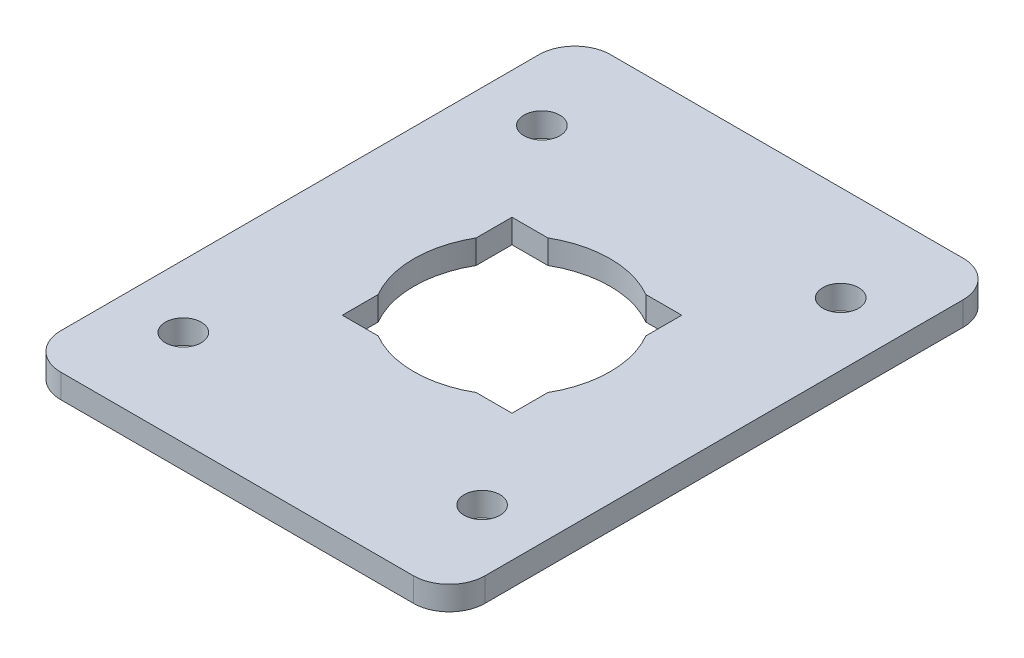
ISO-10303-21;
HEADER;
FILE_DESCRIPTION(('STEP AP214'),'2;1');
FILE_NAME('part.step','',(''),(''),'','','');
FILE_SCHEMA(('AUTOMOTIVE_DESIGN { 1 0 10303 214 1 1 1 1 }'));
ENDSEC;
DATA;
#1=APPLICATION_CONTEXT('core data for automotive mechanical design processes');
#2=APPLICATION_PROTOCOL_DEFINITION('international standard','automotive_design',2000,#1);
#3=PRODUCT_CONTEXT('',#1,'mechanical');
#4=PRODUCT('Part','Part','',(#3));
#5=PRODUCT_RELATED_PRODUCT_CATEGORY('part','',(#4));
#6=PRODUCT_DEFINITION_FORMATION('','',#4);
#7=PRODUCT_DEFINITION_CONTEXT('part definition',#1,'design');
#8=PRODUCT_DEFINITION('design','',#6,#7);
#9=PRODUCT_DEFINITION_SHAPE('','',#8);
#10=(LENGTH_UNIT() NAMED_UNIT(*) SI_UNIT(.MILLI.,.METRE.));
#11=(NAMED_UNIT(*) PLANE_ANGLE_UNIT() SI_UNIT($,.RADIAN.));
#12=(NAMED_UNIT(*) SI_UNIT($,.STERADIAN.) SOLID_ANGLE_UNIT());
#13=UNCERTAINTY_MEASURE_WITH_UNIT(LENGTH_MEASURE(1.E-05),#10,'distance_accuracy_value','');
#14=(GEOMETRIC_REPRESENTATION_CONTEXT(3) GLOBAL_UNCERTAINTY_ASSIGNED_CONTEXT((#13)) GLOBAL_UNIT_ASSIGNED_CONTEXT((#10,
#11,#12)) REPRESENTATION_CONTEXT('',''));
#15=CARTESIAN_POINT('',(0.,0.,0.));
#16=DIRECTION('',(0.,0.,1.));
#17=DIRECTION('',(1.,0.,0.));
#18=AXIS2_PLACEMENT_3D('',#15,#16,#17);
#19=CARTESIAN_POINT('',(0.,2.,0.));
#20=DIRECTION('',(0.,-1.,0.));
#21=DIRECTION('',(0.,0.,-1.));
#22=AXIS2_PLACEMENT_3D('',#19,#20,#21);
#23=PLANE('',#22);
#24=CARTESIAN_POINT('',(-11.6377120476314,2.,-22.25));
#25=DIRECTION('',(0.,-1.,0.));
#26=DIRECTION('',(0.,0.,-1.));
#27=AXIS2_PLACEMENT_3D('',#24,#25,#26);
#28=CIRCLE('',#27,1.5);
#29=CARTESIAN_POINT('',(-11.6377120476314,2.,-23.75));
#30=VERTEX_POINT('',#29);
#31=EDGE_CURVE('E224',#30,#30,#28,.T.);
#32=ORIENTED_EDGE('',*,*,#31,.T.);
#33=EDGE_LOOP('',(#32));
#34=FACE_BOUND('',#33,.T.);
#35=CARTESIAN_POINT('',(13.3622879523686,2.,7.75000000000001));
#36=DIRECTION('',(0.,-1.,0.));
#37=DIRECTION('',(0.,0.,-1.));
#38=AXIS2_PLACEMENT_3D('',#35,#36,#37);
#39=CIRCLE('',#38,1.5);
#40=CARTESIAN_POINT('',(13.3622879523686,2.,6.25000000000001));
#41=VERTEX_POINT('',#40);
#42=EDGE_CURVE('E627',#41,#41,#39,.T.);
#43=ORIENTED_EDGE('',*,*,#42,.T.);
#44=EDGE_LOOP('',(#43));
#45=FACE_BOUND('',#44,.T.);
#46=CARTESIAN_POINT('',(13.3622879523686,2.,-22.25));
#47=DIRECTION('',(0.,-1.,0.));
#48=DIRECTION('',(0.,0.,-1.));
#49=AXIS2_PLACEMENT_3D('',#46,#47,#48);
#50=CIRCLE('',#49,1.5);
#51=CARTESIAN_POINT('',(13.3622879523686,2.,-23.75));
#52=VERTEX_POINT('',#51);
#53=EDGE_CURVE('E629',#52,#52,#50,.T.);
#54=ORIENTED_EDGE('',*,*,#53,.T.);
#55=EDGE_LOOP('',(#54));
#56=FACE_BOUND('',#55,.T.);
#57=CARTESIAN_POINT('',(-11.6377120476314,2.,7.75000000000001));
#58=DIRECTION('',(0.,-1.,0.));
#59=DIRECTION('',(0.,0.,-1.));
#60=AXIS2_PLACEMENT_3D('',#57,#58,#59);
#61=CIRCLE('',#60,1.5);
#62=CARTESIAN_POINT('',(-11.6377120476314,2.,6.25));
#63=VERTEX_POINT('',#62);
#64=EDGE_CURVE('E634',#63,#63,#61,.T.);
#65=ORIENTED_EDGE('',*,*,#64,.T.);
#66=EDGE_LOOP('',(#65));
#67=FACE_BOUND('',#66,.T.);
#68=DIRECTION('',(1.,0.,0.));
#69=VECTOR('',#68,1.);
#70=CARTESIAN_POINT('',(-16.8877120476314,2.,15.75));
#71=LINE('',#70,#69);
#72=CARTESIAN_POINT('',(-13.8877120476314,2.,15.75));
#73=VERTEX_POINT('',#72);
#74=CARTESIAN_POINT('',(15.6122879523686,2.,15.75));
#75=VERTEX_POINT('',#74);
#76=EDGE_CURVE('E278',#73,#75,#71,.T.);
#77=ORIENTED_EDGE('',*,*,#76,.T.);
#78=CARTESIAN_POINT('',(15.6122879523686,2.,12.75));
#79=DIRECTION('',(0.,-1.,0.));
#80=DIRECTION('',(0.,0.,-1.));
#81=AXIS2_PLACEMENT_3D('',#78,#79,#80);
#82=CIRCLE('',#81,3.);
#83=CARTESIAN_POINT('',(18.6122879523686,2.,12.75));
#84=VERTEX_POINT('',#83);
#85=EDGE_CURVE('E318',#75,#84,#82,.F.);
#86=ORIENTED_EDGE('',*,*,#85,.T.);
#87=DIRECTION('',(0.,0.,-1.));
#88=VECTOR('',#87,1.);
#89=CARTESIAN_POINT('',(18.6122879523686,2.,15.75));
#90=LINE('',#89,#88);
#91=CARTESIAN_POINT('',(18.6122879523686,2.,-27.25));
#92=VERTEX_POINT('',#91);
#93=EDGE_CURVE('E282',#84,#92,#90,.T.);
#94=ORIENTED_EDGE('',*,*,#93,.T.);
#95=CARTESIAN_POINT('',(15.6122879523686,2.,-27.25));
#96=DIRECTION('',(0.,-1.,0.));
#97=DIRECTION('',(0.,0.,-1.));
#98=AXIS2_PLACEMENT_3D('',#95,#96,#97);
#99=CIRCLE('',#98,3.);
#100=CARTESIAN_POINT('',(15.6122879523686,2.,-30.25));
#101=VERTEX_POINT('',#100);
#102=EDGE_CURVE('E57',#92,#101,#99,.F.);
#103=ORIENTED_EDGE('',*,*,#102,.T.);
#104=DIRECTION('',(-1.,0.,0.));
#105=VECTOR('',#104,1.);
#106=CARTESIAN_POINT('',(-16.8877120476314,2.,-30.25));
#107=LINE('',#106,#105);
#108=CARTESIAN_POINT('',(-13.8877120476314,2.,-30.25));
#109=VERTEX_POINT('',#108);
#110=EDGE_CURVE('E284',#101,#109,#107,.T.);
#111=ORIENTED_EDGE('',*,*,#110,.T.);
#112=CARTESIAN_POINT('',(-13.8877120476314,2.,-27.25));
#113=DIRECTION('',(0.,-1.,0.));
#114=DIRECTION('',(0.,0.,-1.));
#115=AXIS2_PLACEMENT_3D('',#112,#113,#114);
#116=CIRCLE('',#115,3.);
#117=CARTESIAN_POINT('',(-16.8877120476314,2.,-27.25));
#118=VERTEX_POINT('',#117);
#119=EDGE_CURVE('E314',#109,#118,#116,.F.);
#120=ORIENTED_EDGE('',*,*,#119,.T.);
#121=DIRECTION('',(0.,0.,1.));
#122=VECTOR('',#121,1.);
#123=CARTESIAN_POINT('',(-16.8877120476314,2.,15.75));
#124=LINE('',#123,#122);
#125=CARTESIAN_POINT('',(-16.8877120476314,2.,12.75));
#126=VERTEX_POINT('',#125);
#127=EDGE_CURVE('E275',#118,#126,#124,.T.);
#128=ORIENTED_EDGE('',*,*,#127,.T.);
#129=CARTESIAN_POINT('',(-13.8877120476314,2.,12.75));
#130=DIRECTION('',(0.,-1.,0.));
#131=DIRECTION('',(0.,0.,-1.));
#132=AXIS2_PLACEMENT_3D('',#129,#130,#131);
#133=CIRCLE('',#132,3.);
#134=EDGE_CURVE('E316',#126,#73,#133,.F.);
#135=ORIENTED_EDGE('',*,*,#134,.T.);
#136=EDGE_LOOP('',(#77,#86,#94,#103,#111,#120,#128,#135));
#137=FACE_BOUND('',#136,.T.);
#138=DIRECTION('',(1.,0.,0.));
#139=VECTOR('',#138,1.);
#140=CARTESIAN_POINT('',(4.96472625172183,2.,-0.149999999999997));
#141=LINE('',#140,#139);
#142=CARTESIAN_POINT('',(4.96472625172183,2.,-0.149999999999996));
#143=VERTEX_POINT('',#142);
#144=CARTESIAN_POINT('',(7.96228795236863,2.,-0.149999999999997));
#145=VERTEX_POINT('',#144);
#146=EDGE_CURVE('E175',#143,#145,#141,.T.);
#147=ORIENTED_EDGE('',*,*,#146,.F.);
#148=CARTESIAN_POINT('',(0.862287952368626,2.,-7.25));
#149=DIRECTION('',(0.,1.,0.));
#150=DIRECTION('',(0.,0.,1.));
#151=AXIS2_PLACEMENT_3D('',#148,#149,#150);
#152=CIRCLE('',#151,8.2);
#153=CARTESIAN_POINT('',(-3.24015034698457,2.,-0.149999999999996));
#154=VERTEX_POINT('',#153);
#155=EDGE_CURVE('E220',#154,#143,#152,.T.);
#156=ORIENTED_EDGE('',*,*,#155,.F.);
#157=DIRECTION('',(1.,0.,0.));
#158=VECTOR('',#157,1.);
#159=CARTESIAN_POINT('',(-6.23771204763137,2.,-0.149999999999995));
#160=LINE('',#159,#158);
#161=CARTESIAN_POINT('',(-6.23771204763137,2.,-0.149999999999995));
#162=VERTEX_POINT('',#161);
#163=EDGE_CURVE('E217',#162,#154,#160,.T.);
#164=ORIENTED_EDGE('',*,*,#163,.F.);
#165=DIRECTION('',(0.,0.,1.));
#166=VECTOR('',#165,1.);
#167=CARTESIAN_POINT('',(-6.23771204763137,2.,-3.1475617006468));
#168=LINE('',#167,#166);
#169=CARTESIAN_POINT('',(-6.23771204763137,2.,-3.1475617006468));
#170=VERTEX_POINT('',#169);
#171=EDGE_CURVE('E215',#170,#162,#168,.T.);
#172=ORIENTED_EDGE('',*,*,#171,.F.);
#173=CARTESIAN_POINT('',(0.862287952368626,2.,-7.25));
#174=DIRECTION('',(0.,1.,0.));
#175=DIRECTION('',(0.,0.,1.));
#176=AXIS2_PLACEMENT_3D('',#173,#174,#175);
#177=CIRCLE('',#176,8.2);
#178=CARTESIAN_POINT('',(-6.23771204763137,2.,-11.3524382993532));
#179=VERTEX_POINT('',#178);
#180=EDGE_CURVE('E213',#179,#170,#177,.T.);
#181=ORIENTED_EDGE('',*,*,#180,.F.);
#182=DIRECTION('',(0.,0.,1.));
#183=VECTOR('',#182,1.);
#184=CARTESIAN_POINT('',(-6.23771204763137,2.,-14.35));
#185=LINE('',#184,#183);
#186=CARTESIAN_POINT('',(-6.23771204763137,2.,-14.35));
#187=VERTEX_POINT('',#186);
#188=EDGE_CURVE('E211',#187,#179,#185,.T.);
#189=ORIENTED_EDGE('',*,*,#188,.F.);
#190=DIRECTION('',(-1.,0.,0.));
#191=VECTOR('',#190,1.);
#192=CARTESIAN_POINT('',(-6.23771204763137,2.,-14.35));
#193=LINE('',#192,#191);
#194=CARTESIAN_POINT('',(-3.24015034698458,2.,-14.35));
#195=VERTEX_POINT('',#194);
#196=EDGE_CURVE('E209',#195,#187,#193,.T.);
#197=ORIENTED_EDGE('',*,*,#196,.F.);
#198=CARTESIAN_POINT('',(0.862287952368626,2.,-7.25));
#199=DIRECTION('',(0.,1.,0.));
#200=DIRECTION('',(0.,0.,1.));
#201=AXIS2_PLACEMENT_3D('',#198,#199,#200);
#202=CIRCLE('',#201,8.2);
#203=CARTESIAN_POINT('',(4.96472625172184,2.,-14.35));
#204=VERTEX_POINT('',#203);
#205=EDGE_CURVE('E207',#204,#195,#202,.T.);
#206=ORIENTED_EDGE('',*,*,#205,.F.);
#207=DIRECTION('',(-1.,0.,0.));
#208=VECTOR('',#207,1.);
#209=CARTESIAN_POINT('',(4.96472625172184,2.,-14.35));
#210=LINE('',#209,#208);
#211=CARTESIAN_POINT('',(7.96228795236862,2.,-14.35));
#212=VERTEX_POINT('',#211);
#213=EDGE_CURVE('E205',#212,#204,#210,.T.);
#214=ORIENTED_EDGE('',*,*,#213,.F.);
#215=DIRECTION('',(0.,0.,-1.));
#216=VECTOR('',#215,1.);
#217=CARTESIAN_POINT('',(7.96228795236862,2.,-14.35));
#218=LINE('',#217,#216);
#219=CARTESIAN_POINT('',(7.96228795236862,2.,-11.3524382993532));
#220=VERTEX_POINT('',#219);
#221=EDGE_CURVE('E200',#220,#212,#218,.T.);
#222=ORIENTED_EDGE('',*,*,#221,.F.);
#223=CARTESIAN_POINT('',(0.862287952368626,2.,-7.25));
#224=DIRECTION('',(0.,1.,0.));
#225=DIRECTION('',(0.,0.,1.));
#226=AXIS2_PLACEMENT_3D('',#223,#224,#225);
#227=CIRCLE('',#226,8.2);
#228=CARTESIAN_POINT('',(7.96228795236863,2.,-3.1475617006468));
#229=VERTEX_POINT('',#228);
#230=EDGE_CURVE('E198',#229,#220,#227,.T.);
#231=ORIENTED_EDGE('',*,*,#230,.F.);
#232=DIRECTION('',(0.,0.,-1.));
#233=VECTOR('',#232,1.);
#234=CARTESIAN_POINT('',(7.96228795236863,2.,-3.1475617006468));
#235=LINE('',#234,#233);
#236=EDGE_CURVE('E185',#145,#229,#235,.T.);
#237=ORIENTED_EDGE('',*,*,#236,.F.);
#238=EDGE_LOOP('',(#147,#156,#164,#172,#181,#189,#197,#206,#214,#222,#231,#237));
#239=FACE_BOUND('',#238,.T.);
#240=ADVANCED_FACE('F37',(#34,#45,#56,#67,#137,#239),#23,.F.);
#241=CARTESIAN_POINT('',(0.,0.,0.));
#242=DIRECTION('',(0.,-1.,0.));
#243=DIRECTION('',(0.,0.,-1.));
#244=AXIS2_PLACEMENT_3D('',#241,#242,#243);
#245=PLANE('',#244);
#246=CARTESIAN_POINT('',(-11.6377120476314,0.,-22.25));
#247=DIRECTION('',(0.,-1.,0.));
#248=DIRECTION('',(0.,0.,1.));
#249=AXIS2_PLACEMENT_3D('',#246,#247,#248);
#250=CIRCLE('',#249,1.5);
#251=CARTESIAN_POINT('',(-11.6377120476314,0.,-20.75));
#252=VERTEX_POINT('',#251);
#253=EDGE_CURVE('E625',#252,#252,#250,.T.);
#254=ORIENTED_EDGE('',*,*,#253,.F.);
#255=EDGE_LOOP('',(#254));
#256=FACE_BOUND('',#255,.T.);
#257=CARTESIAN_POINT('',(13.3622879523686,0.,7.75000000000001));
#258=DIRECTION('',(0.,-1.,0.));
#259=DIRECTION('',(0.,0.,1.));
#260=AXIS2_PLACEMENT_3D('',#257,#258,#259);
#261=CIRCLE('',#260,1.5);
#262=CARTESIAN_POINT('',(13.3622879523686,0.,9.25000000000001));
#263=VERTEX_POINT('',#262);
#264=EDGE_CURVE('E642',#263,#263,#261,.T.);
#265=ORIENTED_EDGE('',*,*,#264,.F.);
#266=EDGE_LOOP('',(#265));
#267=FACE_BOUND('',#266,.T.);
#268=CARTESIAN_POINT('',(13.3622879523686,0.,-22.25));
#269=DIRECTION('',(0.,-1.,0.));
#270=DIRECTION('',(0.,0.,-1.));
#271=AXIS2_PLACEMENT_3D('',#268,#269,#270);
#272=CIRCLE('',#271,1.5);
#273=CARTESIAN_POINT('',(13.3622879523686,0.,-23.75));
#274=VERTEX_POINT('',#273);
#275=EDGE_CURVE('E640',#274,#274,#272,.T.);
#276=ORIENTED_EDGE('',*,*,#275,.F.);
#277=EDGE_LOOP('',(#276));
#278=FACE_BOUND('',#277,.T.);
#279=CARTESIAN_POINT('',(-11.6377120476314,0.,7.75000000000001));
#280=DIRECTION('',(0.,-1.,0.));
#281=DIRECTION('',(0.,0.,-1.));
#282=AXIS2_PLACEMENT_3D('',#279,#280,#281);
#283=CIRCLE('',#282,1.5);
#284=CARTESIAN_POINT('',(-11.6377120476314,0.,6.25));
#285=VERTEX_POINT('',#284);
#286=EDGE_CURVE('E637',#285,#285,#283,.T.);
#287=ORIENTED_EDGE('',*,*,#286,.F.);
#288=EDGE_LOOP('',(#287));
#289=FACE_BOUND('',#288,.T.);
#290=DIRECTION('',(0.,0.,-1.));
#291=VECTOR('',#290,1.);
#292=CARTESIAN_POINT('',(18.6122879523686,0.,15.75));
#293=LINE('',#292,#291);
#294=CARTESIAN_POINT('',(18.6122879523686,0.,12.75));
#295=VERTEX_POINT('',#294);
#296=CARTESIAN_POINT('',(18.6122879523686,0.,-27.25));
#297=VERTEX_POINT('',#296);
#298=EDGE_CURVE('E292',#295,#297,#293,.T.);
#299=ORIENTED_EDGE('',*,*,#298,.F.);
#300=CARTESIAN_POINT('',(15.6122879523686,0.,12.75));
#301=DIRECTION('',(0.,-1.,0.));
#302=DIRECTION('',(0.,0.,-1.));
#303=AXIS2_PLACEMENT_3D('',#300,#301,#302);
#304=CIRCLE('',#303,3.);
#305=CARTESIAN_POINT('',(15.6122879523686,0.,15.75));
#306=VERTEX_POINT('',#305);
#307=EDGE_CURVE('E306',#295,#306,#304,.T.);
#308=ORIENTED_EDGE('',*,*,#307,.T.);
#309=DIRECTION('',(1.,0.,0.));
#310=VECTOR('',#309,1.);
#311=CARTESIAN_POINT('',(-16.8877120476314,0.,15.75));
#312=LINE('',#311,#310);
#313=CARTESIAN_POINT('',(-13.8877120476314,0.,15.75));
#314=VERTEX_POINT('',#313);
#315=EDGE_CURVE('E289',#314,#306,#312,.T.);
#316=ORIENTED_EDGE('',*,*,#315,.F.);
#317=CARTESIAN_POINT('',(-13.8877120476314,0.,12.75));
#318=DIRECTION('',(0.,-1.,0.));
#319=DIRECTION('',(0.,0.,-1.));
#320=AXIS2_PLACEMENT_3D('',#317,#318,#319);
#321=CIRCLE('',#320,3.);
#322=CARTESIAN_POINT('',(-16.8877120476314,0.,12.75));
#323=VERTEX_POINT('',#322);
#324=EDGE_CURVE('E304',#314,#323,#321,.T.);
#325=ORIENTED_EDGE('',*,*,#324,.T.);
#326=DIRECTION('',(0.,0.,1.));
#327=VECTOR('',#326,1.);
#328=CARTESIAN_POINT('',(-16.8877120476314,0.,15.75));
#329=LINE('',#328,#327);
#330=CARTESIAN_POINT('',(-16.8877120476314,0.,-27.25));
#331=VERTEX_POINT('',#330);
#332=EDGE_CURVE('E193',#331,#323,#329,.T.);
#333=ORIENTED_EDGE('',*,*,#332,.F.);
#334=CARTESIAN_POINT('',(-13.8877120476314,0.,-27.25));
#335=DIRECTION('',(0.,-1.,0.));
#336=DIRECTION('',(0.,0.,-1.));
#337=AXIS2_PLACEMENT_3D('',#334,#335,#336);
#338=CIRCLE('',#337,3.);
#339=CARTESIAN_POINT('',(-13.8877120476314,0.,-30.25));
#340=VERTEX_POINT('',#339);
#341=EDGE_CURVE('E302',#331,#340,#338,.T.);
#342=ORIENTED_EDGE('',*,*,#341,.T.);
#343=DIRECTION('',(-1.,0.,0.));
#344=VECTOR('',#343,1.);
#345=CARTESIAN_POINT('',(-16.8877120476314,0.,-30.25));
#346=LINE('',#345,#344);
#347=CARTESIAN_POINT('',(15.6122879523686,0.,-30.25));
#348=VERTEX_POINT('',#347);
#349=EDGE_CURVE('E279',#348,#340,#346,.T.);
#350=ORIENTED_EDGE('',*,*,#349,.F.);
#351=CARTESIAN_POINT('',(15.6122879523686,0.,-27.25));
#352=DIRECTION('',(0.,-1.,0.));
#353=DIRECTION('',(0.,0.,-1.));
#354=AXIS2_PLACEMENT_3D('',#351,#352,#353);
#355=CIRCLE('',#354,3.);
#356=EDGE_CURVE('E300',#348,#297,#355,.T.);
#357=ORIENTED_EDGE('',*,*,#356,.T.);
#358=EDGE_LOOP('',(#299,#308,#316,#325,#333,#342,#350,#357));
#359=FACE_BOUND('',#358,.T.);
#360=CARTESIAN_POINT('',(0.862287952368626,0.,-7.25));
#361=DIRECTION('',(0.,1.,0.));
#362=DIRECTION('',(0.,0.,1.));
#363=AXIS2_PLACEMENT_3D('',#360,#361,#362);
#364=CIRCLE('',#363,8.2);
#365=CARTESIAN_POINT('',(-3.24015034698457,0.,-0.149999999999996));
#366=VERTEX_POINT('',#365);
#367=CARTESIAN_POINT('',(4.96472625172183,0.,-0.149999999999996));
#368=VERTEX_POINT('',#367);
#369=EDGE_CURVE('E186',#366,#368,#364,.T.);
#370=ORIENTED_EDGE('',*,*,#369,.T.);
#371=DIRECTION('',(1.,0.,0.));
#372=VECTOR('',#371,1.);
#373=CARTESIAN_POINT('',(4.96472625172183,0.,-0.149999999999997));
#374=LINE('',#373,#372);
#375=CARTESIAN_POINT('',(7.96228795236863,0.,-0.149999999999997));
#376=VERTEX_POINT('',#375);
#377=EDGE_CURVE('E222',#368,#376,#374,.T.);
#378=ORIENTED_EDGE('',*,*,#377,.T.);
#379=DIRECTION('',(0.,0.,-1.));
#380=VECTOR('',#379,1.);
#381=CARTESIAN_POINT('',(7.96228795236863,0.,-3.1475617006468));
#382=LINE('',#381,#380);
#383=CARTESIAN_POINT('',(7.96228795236863,0.,-3.1475617006468));
#384=VERTEX_POINT('',#383);
#385=EDGE_CURVE('E192',#376,#384,#382,.T.);
#386=ORIENTED_EDGE('',*,*,#385,.T.);
#387=CARTESIAN_POINT('',(0.862287952368626,0.,-7.25));
#388=DIRECTION('',(0.,1.,0.));
#389=DIRECTION('',(0.,0.,1.));
#390=AXIS2_PLACEMENT_3D('',#387,#388,#389);
#391=CIRCLE('',#390,8.2);
#392=CARTESIAN_POINT('',(7.96228795236862,0.,-11.3524382993532));
#393=VERTEX_POINT('',#392);
#394=EDGE_CURVE('E226',#384,#393,#391,.T.);
#395=ORIENTED_EDGE('',*,*,#394,.T.);
#396=DIRECTION('',(0.,0.,-1.));
#397=VECTOR('',#396,1.);
#398=CARTESIAN_POINT('',(7.96228795236862,0.,-14.35));
#399=LINE('',#398,#397);
#400=CARTESIAN_POINT('',(7.96228795236862,0.,-14.35));
#401=VERTEX_POINT('',#400);
#402=EDGE_CURVE('E229',#393,#401,#399,.T.);
#403=ORIENTED_EDGE('',*,*,#402,.T.);
#404=DIRECTION('',(-1.,0.,0.));
#405=VECTOR('',#404,1.);
#406=CARTESIAN_POINT('',(4.96472625172184,0.,-14.35));
#407=LINE('',#406,#405);
#408=CARTESIAN_POINT('',(4.96472625172184,0.,-14.35));
#409=VERTEX_POINT('',#408);
#410=EDGE_CURVE('E232',#401,#409,#407,.T.);
#411=ORIENTED_EDGE('',*,*,#410,.T.);
#412=CARTESIAN_POINT('',(0.862287952368626,0.,-7.25));
#413=DIRECTION('',(0.,1.,0.));
#414=DIRECTION('',(0.,0.,1.));
#415=AXIS2_PLACEMENT_3D('',#412,#413,#414);
#416=CIRCLE('',#415,8.2);
#417=CARTESIAN_POINT('',(-3.24015034698458,0.,-14.35));
#418=VERTEX_POINT('',#417);
#419=EDGE_CURVE('E235',#409,#418,#416,.T.);
#420=ORIENTED_EDGE('',*,*,#419,.T.);
#421=DIRECTION('',(-1.,0.,0.));
#422=VECTOR('',#421,1.);
#423=CARTESIAN_POINT('',(-6.23771204763137,0.,-14.35));
#424=LINE('',#423,#422);
#425=CARTESIAN_POINT('',(-6.23771204763137,0.,-14.35));
#426=VERTEX_POINT('',#425);
#427=EDGE_CURVE('E238',#418,#426,#424,.T.);
#428=ORIENTED_EDGE('',*,*,#427,.T.);
#429=DIRECTION('',(0.,0.,1.));
#430=VECTOR('',#429,1.);
#431=CARTESIAN_POINT('',(-6.23771204763137,0.,-14.35));
#432=LINE('',#431,#430);
#433=CARTESIAN_POINT('',(-6.23771204763137,0.,-11.3524382993532));
#434=VERTEX_POINT('',#433);
#435=EDGE_CURVE('E241',#426,#434,#432,.T.);
#436=ORIENTED_EDGE('',*,*,#435,.T.);
#437=CARTESIAN_POINT('',(0.862287952368626,0.,-7.25));
#438=DIRECTION('',(0.,1.,0.));
#439=DIRECTION('',(0.,0.,1.));
#440=AXIS2_PLACEMENT_3D('',#437,#438,#439);
#441=CIRCLE('',#440,8.2);
#442=CARTESIAN_POINT('',(-6.23771204763137,0.,-3.1475617006468));
#443=VERTEX_POINT('',#442);
#444=EDGE_CURVE('E244',#434,#443,#441,.T.);
#445=ORIENTED_EDGE('',*,*,#444,.T.);
#446=DIRECTION('',(0.,0.,1.));
#447=VECTOR('',#446,1.);
#448=CARTESIAN_POINT('',(-6.23771204763137,0.,-3.1475617006468));
#449=LINE('',#448,#447);
#450=CARTESIAN_POINT('',(-6.23771204763137,0.,-0.149999999999995));
#451=VERTEX_POINT('',#450);
#452=EDGE_CURVE('E247',#443,#451,#449,.T.);
#453=ORIENTED_EDGE('',*,*,#452,.T.);
#454=DIRECTION('',(1.,0.,0.));
#455=VECTOR('',#454,1.);
#456=CARTESIAN_POINT('',(-6.23771204763137,0.,-0.149999999999995));
#457=LINE('',#456,#455);
#458=EDGE_CURVE('E250',#451,#366,#457,.T.);
#459=ORIENTED_EDGE('',*,*,#458,.T.);
#460=EDGE_LOOP('',(#370,#378,#386,#395,#403,#411,#420,#428,#436,#445,#453,#459));
#461=FACE_BOUND('',#460,.T.);
#462=ADVANCED_FACE('F331',(#256,#267,#278,#289,#359,#461),#245,.T.);
#463=CARTESIAN_POINT('',(-16.8877120476314,2.,15.75));
#464=DIRECTION('',(1.,0.,0.));
#465=DIRECTION('',(0.,0.,-1.));
#466=AXIS2_PLACEMENT_3D('',#463,#464,#465);
#467=PLANE('',#466);
#468=ORIENTED_EDGE('',*,*,#332,.T.);
#469=DIRECTION('',(0.,-1.,0.));
#470=VECTOR('',#469,1.);
#471=CARTESIAN_POINT('',(-16.8877120476314,2.,12.75));
#472=LINE('',#471,#470);
#473=EDGE_CURVE('E323',#323,#126,#472,.F.);
#474=ORIENTED_EDGE('',*,*,#473,.T.);
#475=ORIENTED_EDGE('',*,*,#127,.F.);
#476=DIRECTION('',(0.,-1.,0.));
#477=VECTOR('',#476,1.);
#478=CARTESIAN_POINT('',(-16.8877120476314,2.,-27.25));
#479=LINE('',#478,#477);
#480=EDGE_CURVE('E320',#118,#331,#479,.T.);
#481=ORIENTED_EDGE('',*,*,#480,.T.);
#482=EDGE_LOOP('',(#468,#474,#475,#481));
#483=FACE_BOUND('',#482,.T.);
#484=ADVANCED_FACE('F340',(#483),#467,.F.);
#485=CARTESIAN_POINT('',(-16.8877120476314,2.,15.75));
#486=DIRECTION('',(0.,0.,-1.));
#487=DIRECTION('',(-1.,0.,0.));
#488=AXIS2_PLACEMENT_3D('',#485,#486,#487);
#489=PLANE('',#488);
#490=ORIENTED_EDGE('',*,*,#315,.T.);
#491=DIRECTION('',(0.,-1.,0.));
#492=VECTOR('',#491,1.);
#493=CARTESIAN_POINT('',(15.6122879523686,2.,15.75));
#494=LINE('',#493,#492);
#495=EDGE_CURVE('E311',#306,#75,#494,.F.);
#496=ORIENTED_EDGE('',*,*,#495,.T.);
#497=ORIENTED_EDGE('',*,*,#76,.F.);
#498=DIRECTION('',(0.,-1.,0.));
#499=VECTOR('',#498,1.);
#500=CARTESIAN_POINT('',(-13.8877120476314,2.,15.75));
#501=LINE('',#500,#499);
#502=EDGE_CURVE('E308',#73,#314,#501,.T.);
#503=ORIENTED_EDGE('',*,*,#502,.T.);
#504=EDGE_LOOP('',(#490,#496,#497,#503));
#505=FACE_BOUND('',#504,.T.);
#506=ADVANCED_FACE('F349',(#505),#489,.F.);
#507=CARTESIAN_POINT('',(18.6122879523686,2.,15.75));
#508=DIRECTION('',(-1.,0.,0.));
#509=DIRECTION('',(0.,0.,1.));
#510=AXIS2_PLACEMENT_3D('',#507,#508,#509);
#511=PLANE('',#510);
#512=ORIENTED_EDGE('',*,*,#93,.F.);
#513=DIRECTION('',(0.,-1.,0.));
#514=VECTOR('',#513,1.);
#515=CARTESIAN_POINT('',(18.6122879523686,2.,12.75));
#516=LINE('',#515,#514);
#517=EDGE_CURVE('E297',#84,#295,#516,.T.);
#518=ORIENTED_EDGE('',*,*,#517,.T.);
#519=ORIENTED_EDGE('',*,*,#298,.T.);
#520=DIRECTION('',(0.,-1.,0.));
#521=VECTOR('',#520,1.);
#522=CARTESIAN_POINT('',(18.6122879523686,2.,-27.25));
#523=LINE('',#522,#521);
#524=EDGE_CURVE('E286',#297,#92,#523,.F.);
#525=ORIENTED_EDGE('',*,*,#524,.T.);
#526=EDGE_LOOP('',(#512,#518,#519,#525));
#527=FACE_BOUND('',#526,.T.);
#528=ADVANCED_FACE('F357',(#527),#511,.F.);
#529=CARTESIAN_POINT('',(-16.8877120476314,2.,-30.25));
#530=DIRECTION('',(0.,0.,1.));
#531=DIRECTION('',(1.,0.,0.));
#532=AXIS2_PLACEMENT_3D('',#529,#530,#531);
#533=PLANE('',#532);
#534=ORIENTED_EDGE('',*,*,#349,.T.);
#535=DIRECTION('',(0.,-1.,0.));
#536=VECTOR('',#535,1.);
#537=CARTESIAN_POINT('',(-13.8877120476314,2.,-30.25));
#538=LINE('',#537,#536);
#539=EDGE_CURVE('E11',#340,#109,#538,.F.);
#540=ORIENTED_EDGE('',*,*,#539,.T.);
#541=ORIENTED_EDGE('',*,*,#110,.F.);
#542=DIRECTION('',(0.,-1.,0.));
#543=VECTOR('',#542,1.);
#544=CARTESIAN_POINT('',(15.6122879523686,2.,-30.25));
#545=LINE('',#544,#543);
#546=EDGE_CURVE('E45',#101,#348,#545,.T.);
#547=ORIENTED_EDGE('',*,*,#546,.T.);
#548=EDGE_LOOP('',(#534,#540,#541,#547));
#549=FACE_BOUND('',#548,.T.);
#550=ADVANCED_FACE('F327',(#549),#533,.F.);
#551=CARTESIAN_POINT('',(4.96472625172183,2.,-0.149999999999997));
#552=DIRECTION('',(0.,0.,-1.));
#553=DIRECTION('',(-1.,0.,0.));
#554=AXIS2_PLACEMENT_3D('',#551,#552,#553);
#555=PLANE('',#554);
#556=ORIENTED_EDGE('',*,*,#377,.F.);
#557=DIRECTION('',(0.,-1.,0.));
#558=VECTOR('',#557,1.);
#559=CARTESIAN_POINT('',(4.96472625172183,2.,-0.149999999999996));
#560=LINE('',#559,#558);
#561=EDGE_CURVE('E181',#143,#368,#560,.T.);
#562=ORIENTED_EDGE('',*,*,#561,.F.);
#563=ORIENTED_EDGE('',*,*,#146,.T.);
#564=DIRECTION('',(0.,-1.,0.));
#565=VECTOR('',#564,1.);
#566=CARTESIAN_POINT('',(7.96228795236863,2.,-0.149999999999997));
#567=LINE('',#566,#565);
#568=EDGE_CURVE('E178',#145,#376,#567,.T.);
#569=ORIENTED_EDGE('',*,*,#568,.T.);
#570=EDGE_LOOP('',(#556,#562,#563,#569));
#571=FACE_BOUND('',#570,.T.);
#572=ADVANCED_FACE('F177',(#571),#555,.T.);
#573=CARTESIAN_POINT('',(7.96228795236863,2.,-3.1475617006468));
#574=DIRECTION('',(-1.,0.,0.));
#575=DIRECTION('',(0.,0.,1.));
#576=AXIS2_PLACEMENT_3D('',#573,#574,#575);
#577=PLANE('',#576);
#578=ORIENTED_EDGE('',*,*,#385,.F.);
#579=ORIENTED_EDGE('',*,*,#568,.F.);
#580=ORIENTED_EDGE('',*,*,#236,.T.);
#581=DIRECTION('',(0.,-1.,0.));
#582=VECTOR('',#581,1.);
#583=CARTESIAN_POINT('',(7.96228795236863,2.,-3.1475617006468));
#584=LINE('',#583,#582);
#585=EDGE_CURVE('E194',#229,#384,#584,.T.);
#586=ORIENTED_EDGE('',*,*,#585,.T.);
#587=EDGE_LOOP('',(#578,#579,#580,#586));
#588=FACE_BOUND('',#587,.T.);
#589=ADVANCED_FACE('F189',(#588),#577,.T.);
#590=CARTESIAN_POINT('',(0.862287952368626,2.,-7.25));
#591=DIRECTION('',(0.,-1.,0.));
#592=DIRECTION('',(0.,0.,-1.));
#593=AXIS2_PLACEMENT_3D('',#590,#591,#592);
#594=CYLINDRICAL_SURFACE('',#593,8.2);
#595=ORIENTED_EDGE('',*,*,#394,.F.);
#596=ORIENTED_EDGE('',*,*,#585,.F.);
#597=ORIENTED_EDGE('',*,*,#230,.T.);
#598=DIRECTION('',(0.,-1.,0.));
#599=VECTOR('',#598,1.);
#600=CARTESIAN_POINT('',(7.96228795236862,2.,-11.3524382993532));
#601=LINE('',#600,#599);
#602=EDGE_CURVE('E272',#220,#393,#601,.T.);
#603=ORIENTED_EDGE('',*,*,#602,.T.);
#604=EDGE_LOOP('',(#595,#596,#597,#603));
#605=FACE_BOUND('',#604,.T.);
#606=ADVANCED_FACE('F492',(#605),#594,.F.);
#607=CARTESIAN_POINT('',(7.96228795236862,2.,-14.35));
#608=DIRECTION('',(-1.,0.,0.));
#609=DIRECTION('',(0.,0.,1.));
#610=AXIS2_PLACEMENT_3D('',#607,#608,#609);
#611=PLANE('',#610);
#612=ORIENTED_EDGE('',*,*,#402,.F.);
#613=ORIENTED_EDGE('',*,*,#602,.F.);
#614=ORIENTED_EDGE('',*,*,#221,.T.);
#615=DIRECTION('',(0.,-1.,0.));
#616=VECTOR('',#615,1.);
#617=CARTESIAN_POINT('',(7.96228795236862,2.,-14.35));
#618=LINE('',#617,#616);
#619=EDGE_CURVE('E270',#212,#401,#618,.T.);
#620=ORIENTED_EDGE('',*,*,#619,.T.);
#621=EDGE_LOOP('',(#612,#613,#614,#620));
#622=FACE_BOUND('',#621,.T.);
#623=ADVANCED_FACE('F488',(#622),#611,.T.);
#624=CARTESIAN_POINT('',(4.96472625172184,2.,-14.35));
#625=DIRECTION('',(0.,0.,1.));
#626=DIRECTION('',(1.,0.,0.));
#627=AXIS2_PLACEMENT_3D('',#624,#625,#626);
#628=PLANE('',#627);
#629=ORIENTED_EDGE('',*,*,#410,.F.);
#630=ORIENTED_EDGE('',*,*,#619,.F.);
#631=ORIENTED_EDGE('',*,*,#213,.T.);
#632=DIRECTION('',(0.,-1.,0.));
#633=VECTOR('',#632,1.);
#634=CARTESIAN_POINT('',(4.96472625172184,2.,-14.35));
#635=LINE('',#634,#633);
#636=EDGE_CURVE('E268',#204,#409,#635,.T.);
#637=ORIENTED_EDGE('',*,*,#636,.T.);
#638=EDGE_LOOP('',(#629,#630,#631,#637));
#639=FACE_BOUND('',#638,.T.);
#640=ADVANCED_FACE('F484',(#639),#628,.T.);
#641=CARTESIAN_POINT('',(0.862287952368626,2.,-7.25));
#642=DIRECTION('',(0.,-1.,0.));
#643=DIRECTION('',(0.,0.,-1.));
#644=AXIS2_PLACEMENT_3D('',#641,#642,#643);
#645=CYLINDRICAL_SURFACE('',#644,8.2);
#646=ORIENTED_EDGE('',*,*,#419,.F.);
#647=ORIENTED_EDGE('',*,*,#636,.F.);
#648=ORIENTED_EDGE('',*,*,#205,.T.);
#649=DIRECTION('',(0.,-1.,0.));
#650=VECTOR('',#649,1.);
#651=CARTESIAN_POINT('',(-3.24015034698458,2.,-14.35));
#652=LINE('',#651,#650);
#653=EDGE_CURVE('E266',#195,#418,#652,.T.);
#654=ORIENTED_EDGE('',*,*,#653,.T.);
#655=EDGE_LOOP('',(#646,#647,#648,#654));
#656=FACE_BOUND('',#655,.T.);
#657=ADVANCED_FACE('F480',(#656),#645,.F.);
#658=CARTESIAN_POINT('',(-6.23771204763137,2.,-14.35));
#659=DIRECTION('',(0.,0.,1.));
#660=DIRECTION('',(1.,0.,0.));
#661=AXIS2_PLACEMENT_3D('',#658,#659,#660);
#662=PLANE('',#661);
#663=ORIENTED_EDGE('',*,*,#427,.F.);
#664=ORIENTED_EDGE('',*,*,#653,.F.);
#665=ORIENTED_EDGE('',*,*,#196,.T.);
#666=DIRECTION('',(0.,-1.,0.));
#667=VECTOR('',#666,1.);
#668=CARTESIAN_POINT('',(-6.23771204763137,2.,-14.35));
#669=LINE('',#668,#667);
#670=EDGE_CURVE('E264',#187,#426,#669,.T.);
#671=ORIENTED_EDGE('',*,*,#670,.T.);
#672=EDGE_LOOP('',(#663,#664,#665,#671));
#673=FACE_BOUND('',#672,.T.);
#674=ADVANCED_FACE('F476',(#673),#662,.T.);
#675=CARTESIAN_POINT('',(-6.23771204763137,2.,-14.35));
#676=DIRECTION('',(1.,0.,0.));
#677=DIRECTION('',(0.,0.,-1.));
#678=AXIS2_PLACEMENT_3D('',#675,#676,#677);
#679=PLANE('',#678);
#680=ORIENTED_EDGE('',*,*,#435,.F.);
#681=ORIENTED_EDGE('',*,*,#670,.F.);
#682=ORIENTED_EDGE('',*,*,#188,.T.);
#683=DIRECTION('',(0.,-1.,0.));
#684=VECTOR('',#683,1.);
#685=CARTESIAN_POINT('',(-6.23771204763137,2.,-11.3524382993532));
#686=LINE('',#685,#684);
#687=EDGE_CURVE('E262',#179,#434,#686,.T.);
#688=ORIENTED_EDGE('',*,*,#687,.T.);
#689=EDGE_LOOP('',(#680,#681,#682,#688));
#690=FACE_BOUND('',#689,.T.);
#691=ADVANCED_FACE('F472',(#690),#679,.T.);
#692=CARTESIAN_POINT('',(0.862287952368626,2.,-7.25));
#693=DIRECTION('',(0.,-1.,0.));
#694=DIRECTION('',(0.,0.,-1.));
#695=AXIS2_PLACEMENT_3D('',#692,#693,#694);
#696=CYLINDRICAL_SURFACE('',#695,8.2);
#697=ORIENTED_EDGE('',*,*,#444,.F.);
#698=ORIENTED_EDGE('',*,*,#687,.F.);
#699=ORIENTED_EDGE('',*,*,#180,.T.);
#700=DIRECTION('',(0.,-1.,0.));
#701=VECTOR('',#700,1.);
#702=CARTESIAN_POINT('',(-6.23771204763137,2.,-3.1475617006468));
#703=LINE('',#702,#701);
#704=EDGE_CURVE('E260',#170,#443,#703,.T.);
#705=ORIENTED_EDGE('',*,*,#704,.T.);
#706=EDGE_LOOP('',(#697,#698,#699,#705));
#707=FACE_BOUND('',#706,.T.);
#708=ADVANCED_FACE('F468',(#707),#696,.F.);
#709=CARTESIAN_POINT('',(-6.23771204763137,2.,-3.1475617006468));
#710=DIRECTION('',(1.,0.,0.));
#711=DIRECTION('',(0.,0.,-1.));
#712=AXIS2_PLACEMENT_3D('',#709,#710,#711);
#713=PLANE('',#712);
#714=ORIENTED_EDGE('',*,*,#452,.F.);
#715=ORIENTED_EDGE('',*,*,#704,.F.);
#716=ORIENTED_EDGE('',*,*,#171,.T.);
#717=DIRECTION('',(0.,-1.,0.));
#718=VECTOR('',#717,1.);
#719=CARTESIAN_POINT('',(-6.23771204763137,2.,-0.149999999999995));
#720=LINE('',#719,#718);
#721=EDGE_CURVE('E258',#162,#451,#720,.T.);
#722=ORIENTED_EDGE('',*,*,#721,.T.);
#723=EDGE_LOOP('',(#714,#715,#716,#722));
#724=FACE_BOUND('',#723,.T.);
#725=ADVANCED_FACE('F464',(#724),#713,.T.);
#726=CARTESIAN_POINT('',(-6.23771204763137,2.,-0.149999999999995));
#727=DIRECTION('',(0.,0.,-1.));
#728=DIRECTION('',(-1.,0.,0.));
#729=AXIS2_PLACEMENT_3D('',#726,#727,#728);
#730=PLANE('',#729);
#731=ORIENTED_EDGE('',*,*,#458,.F.);
#732=ORIENTED_EDGE('',*,*,#721,.F.);
#733=ORIENTED_EDGE('',*,*,#163,.T.);
#734=DIRECTION('',(0.,-1.,0.));
#735=VECTOR('',#734,1.);
#736=CARTESIAN_POINT('',(-3.24015034698457,2.,-0.149999999999996));
#737=LINE('',#736,#735);
#738=EDGE_CURVE('E256',#154,#366,#737,.T.);
#739=ORIENTED_EDGE('',*,*,#738,.T.);
#740=EDGE_LOOP('',(#731,#732,#733,#739));
#741=FACE_BOUND('',#740,.T.);
#742=ADVANCED_FACE('F460',(#741),#730,.T.);
#743=CARTESIAN_POINT('',(0.862287952368626,2.,-7.25));
#744=DIRECTION('',(0.,-1.,0.));
#745=DIRECTION('',(0.,0.,-1.));
#746=AXIS2_PLACEMENT_3D('',#743,#744,#745);
#747=CYLINDRICAL_SURFACE('',#746,8.2);
#748=ORIENTED_EDGE('',*,*,#369,.F.);
#749=ORIENTED_EDGE('',*,*,#738,.F.);
#750=ORIENTED_EDGE('',*,*,#155,.T.);
#751=ORIENTED_EDGE('',*,*,#561,.T.);
#752=EDGE_LOOP('',(#748,#749,#750,#751));
#753=FACE_BOUND('',#752,.T.);
#754=ADVANCED_FACE('F391',(#753),#747,.F.);
#755=CARTESIAN_POINT('',(15.6122879523686,2.,12.75));
#756=DIRECTION('',(0.,-1.,0.));
#757=DIRECTION('',(0.,0.,-1.));
#758=AXIS2_PLACEMENT_3D('',#755,#756,#757);
#759=CYLINDRICAL_SURFACE('',#758,3.);
#760=ORIENTED_EDGE('',*,*,#85,.F.);
#761=ORIENTED_EDGE('',*,*,#495,.F.);
#762=ORIENTED_EDGE('',*,*,#307,.F.);
#763=ORIENTED_EDGE('',*,*,#517,.F.);
#764=EDGE_LOOP('',(#760,#761,#762,#763));
#765=FACE_BOUND('',#764,.T.);
#766=ADVANCED_FACE('F354',(#765),#759,.T.);
#767=CARTESIAN_POINT('',(-13.8877120476314,2.,12.75));
#768=DIRECTION('',(0.,-1.,0.));
#769=DIRECTION('',(0.,0.,-1.));
#770=AXIS2_PLACEMENT_3D('',#767,#768,#769);
#771=CYLINDRICAL_SURFACE('',#770,3.);
#772=ORIENTED_EDGE('',*,*,#134,.F.);
#773=ORIENTED_EDGE('',*,*,#473,.F.);
#774=ORIENTED_EDGE('',*,*,#324,.F.);
#775=ORIENTED_EDGE('',*,*,#502,.F.);
#776=EDGE_LOOP('',(#772,#773,#774,#775));
#777=FACE_BOUND('',#776,.T.);
#778=ADVANCED_FACE('F346',(#777),#771,.T.);
#779=CARTESIAN_POINT('',(-13.8877120476314,2.,-27.25));
#780=DIRECTION('',(0.,-1.,0.));
#781=DIRECTION('',(0.,0.,-1.));
#782=AXIS2_PLACEMENT_3D('',#779,#780,#781);
#783=CYLINDRICAL_SURFACE('',#782,3.);
#784=ORIENTED_EDGE('',*,*,#119,.F.);
#785=ORIENTED_EDGE('',*,*,#539,.F.);
#786=ORIENTED_EDGE('',*,*,#341,.F.);
#787=ORIENTED_EDGE('',*,*,#480,.F.);
#788=EDGE_LOOP('',(#784,#785,#786,#787));
#789=FACE_BOUND('',#788,.T.);
#790=ADVANCED_FACE('F337',(#789),#783,.T.);
#791=CARTESIAN_POINT('',(15.6122879523686,2.,-27.25));
#792=DIRECTION('',(0.,-1.,0.));
#793=DIRECTION('',(0.,0.,-1.));
#794=AXIS2_PLACEMENT_3D('',#791,#792,#793);
#795=CYLINDRICAL_SURFACE('',#794,3.);
#796=ORIENTED_EDGE('',*,*,#102,.F.);
#797=ORIENTED_EDGE('',*,*,#524,.F.);
#798=ORIENTED_EDGE('',*,*,#356,.F.);
#799=ORIENTED_EDGE('',*,*,#546,.F.);
#800=EDGE_LOOP('',(#796,#797,#798,#799));
#801=FACE_BOUND('',#800,.T.);
#802=ADVANCED_FACE('F39',(#801),#795,.T.);
#803=CARTESIAN_POINT('',(-11.6377120476314,10.,7.75000000000001));
#804=DIRECTION('',(0.,-1.,0.));
#805=DIRECTION('',(0.,0.,-1.));
#806=AXIS2_PLACEMENT_3D('',#803,#804,#805);
#807=CYLINDRICAL_SURFACE('',#806,1.5);
#808=ORIENTED_EDGE('',*,*,#286,.T.);
#809=EDGE_LOOP('',(#808));
#810=FACE_BOUND('',#809,.T.);
#811=ORIENTED_EDGE('',*,*,#64,.F.);
#812=EDGE_LOOP('',(#811));
#813=FACE_BOUND('',#812,.T.);
#814=ADVANCED_FACE('F360',(#810,#813),#807,.F.);
#815=CARTESIAN_POINT('',(13.3622879523686,10.,-22.25));
#816=DIRECTION('',(0.,-1.,0.));
#817=DIRECTION('',(0.,0.,-1.));
#818=AXIS2_PLACEMENT_3D('',#815,#816,#817);
#819=CYLINDRICAL_SURFACE('',#818,1.5);
#820=ORIENTED_EDGE('',*,*,#275,.T.);
#821=EDGE_LOOP('',(#820));
#822=FACE_BOUND('',#821,.T.);
#823=ORIENTED_EDGE('',*,*,#53,.F.);
#824=EDGE_LOOP('',(#823));
#825=FACE_BOUND('',#824,.T.);
#826=ADVANCED_FACE('F365',(#822,#825),#819,.F.);
#827=CARTESIAN_POINT('',(13.3622879523686,10.,7.75000000000001));
#828=DIRECTION('',(0.,-1.,0.));
#829=DIRECTION('',(0.,0.,-1.));
#830=AXIS2_PLACEMENT_3D('',#827,#828,#829);
#831=CYLINDRICAL_SURFACE('',#830,1.5);
#832=ORIENTED_EDGE('',*,*,#264,.T.);
#833=EDGE_LOOP('',(#832));
#834=FACE_BOUND('',#833,.T.);
#835=ORIENTED_EDGE('',*,*,#42,.F.);
#836=EDGE_LOOP('',(#835));
#837=FACE_BOUND('',#836,.T.);
#838=ADVANCED_FACE('F432',(#834,#837),#831,.F.);
#839=CARTESIAN_POINT('',(-11.6377120476314,10.,-22.25));
#840=DIRECTION('',(0.,-1.,0.));
#841=DIRECTION('',(0.,0.,-1.));
#842=AXIS2_PLACEMENT_3D('',#839,#840,#841);
#843=CYLINDRICAL_SURFACE('',#842,1.5);
#844=ORIENTED_EDGE('',*,*,#253,.T.);
#845=EDGE_LOOP('',(#844));
#846=FACE_BOUND('',#845,.T.);
#847=ORIENTED_EDGE('',*,*,#31,.F.);
#848=EDGE_LOOP('',(#847));
#849=FACE_BOUND('',#848,.T.);
#850=ADVANCED_FACE('F442',(#846,#849),#843,.F.);
#851=CLOSED_SHELL('',(#240,#462,#484,#506,#528,#550,#572,#589,#606,#623,#640,#657,#674,#691,
#708,#725,#742,#754,#766,#778,#790,#802,#814,#826,#838,#850));
#852=MANIFOLD_SOLID_BREP('B2',#851);
#853=ADVANCED_BREP_SHAPE_REPRESENTATION('',(#18,#852),#14);
#854=SHAPE_DEFINITION_REPRESENTATION(#9,#853);
ENDSEC;
END-ISO-10303-21;
